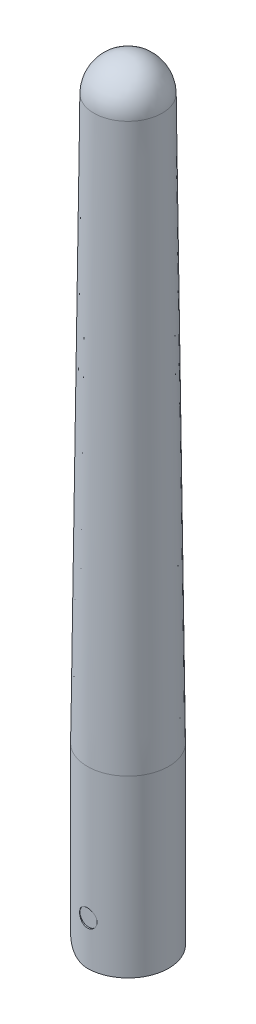
ISO-10303-21;
HEADER;
FILE_DESCRIPTION(('STEP AP214'),'2;1');
FILE_NAME('part.step','',(''),(''),'','','');
FILE_SCHEMA(('AUTOMOTIVE_DESIGN { 1 0 10303 214 1 1 1 1 }'));
ENDSEC;
DATA;
#1=APPLICATION_CONTEXT('core data for automotive mechanical design processes');
#2=APPLICATION_PROTOCOL_DEFINITION('international standard','automotive_design',2000,#1);
#3=PRODUCT_CONTEXT('',#1,'mechanical');
#4=PRODUCT('Part','Part','',(#3));
#5=PRODUCT_RELATED_PRODUCT_CATEGORY('part','',(#4));
#6=PRODUCT_DEFINITION_FORMATION('','',#4);
#7=PRODUCT_DEFINITION_CONTEXT('part definition',#1,'design');
#8=PRODUCT_DEFINITION('design','',#6,#7);
#9=PRODUCT_DEFINITION_SHAPE('','',#8);
#10=(LENGTH_UNIT() NAMED_UNIT(*) SI_UNIT(.MILLI.,.METRE.));
#11=(NAMED_UNIT(*) PLANE_ANGLE_UNIT() SI_UNIT($,.RADIAN.));
#12=(NAMED_UNIT(*) SI_UNIT($,.STERADIAN.) SOLID_ANGLE_UNIT());
#13=UNCERTAINTY_MEASURE_WITH_UNIT(LENGTH_MEASURE(1.E-05),#10,'distance_accuracy_value','');
#14=(GEOMETRIC_REPRESENTATION_CONTEXT(3) GLOBAL_UNCERTAINTY_ASSIGNED_CONTEXT((#13)) GLOBAL_UNIT_ASSIGNED_CONTEXT((#10,
#11,#12)) REPRESENTATION_CONTEXT('',''));
#15=CARTESIAN_POINT('',(0.,0.,0.));
#16=DIRECTION('',(0.,0.,1.));
#17=DIRECTION('',(1.,0.,0.));
#18=AXIS2_PLACEMENT_3D('',#15,#16,#17);
#19=CARTESIAN_POINT('',(0.,5.,-5.));
#20=DIRECTION('',(0.,0.,1.));
#21=DIRECTION('',(1.,0.,0.));
#22=AXIS2_PLACEMENT_3D('',#19,#20,#21);
#23=CYLINDRICAL_SURFACE('',#22,0.999999999999999);
#24=CARTESIAN_POINT('',(0.,6.,-4.65));
#25=CARTESIAN_POINT('',(-0.0554857924595718,5.99999807353634,-4.64999897405825));
#26=CARTESIAN_POINT('',(-0.110995075985709,5.9953663965125,-4.64899676720025));
#27=CARTESIAN_POINT('',(-0.220438479357284,5.97698037923054,-4.64509553965485));
#28=CARTESIAN_POINT('',(-0.274371418026741,5.963219372399,-4.64219513285273));
#29=CARTESIAN_POINT('',(-0.379064488271266,5.92702440035236,-4.63482063282781));
#30=CARTESIAN_POINT('',(-0.429827816687441,5.90459934329033,-4.6303481563912));
#31=CARTESIAN_POINT('',(-0.526869356090529,5.85174074893083,-4.6203129291471));
#32=CARTESIAN_POINT('',(-0.573147713364676,5.82130747295948,-4.61475021391805));
#33=CARTESIAN_POINT('',(-0.660626988615055,5.75279562723433,-4.60304781125343));
#34=CARTESIAN_POINT('',(-0.701748213889969,5.71461648115752,-4.59690116707922));
#35=CARTESIAN_POINT('',(-0.777055128833326,5.63191263980964,-4.58477300899257));
#36=CARTESIAN_POINT('',(-0.811240216336226,5.58738739416839,-4.57879150945618));
#37=CARTESIAN_POINT('',(-0.87205356348161,5.4926692674297,-4.56760243735744));
#38=CARTESIAN_POINT('',(-0.898597454097875,5.44242106965654,-4.56240378679981));
#39=CARTESIAN_POINT('',(-0.942833879374378,5.33804715155961,-4.55346866998021));
#40=CARTESIAN_POINT('',(-0.960527434603887,5.28392187914083,-4.54973203513792));
#41=CARTESIAN_POINT('',(-0.9862984982383,5.17419330395106,-4.54421478538731));
#42=CARTESIAN_POINT('',(-0.994516850008705,5.11862454935533,-4.54240555245428));
#43=CARTESIAN_POINT('',(-1.0015420598175,5.00686978789065,-4.54086196758284));
#44=CARTESIAN_POINT('',(-1.00035003485907,4.95068385507079,-4.54112736938713));
#45=CARTESIAN_POINT('',(-0.988701778425597,4.84033331199993,-4.54367713915638));
#46=CARTESIAN_POINT('',(-0.97840872062276,4.78615053181548,-4.54592594463625));
#47=CARTESIAN_POINT('',(-0.949108903825455,4.68029927607725,-4.55213295894203));
#48=CARTESIAN_POINT('',(-0.930101670596141,4.6286309375314,-4.55609126079991));
#49=CARTESIAN_POINT('',(-0.883762014712858,4.52881418854472,-4.56530657720991));
#50=CARTESIAN_POINT('',(-0.856366458973154,4.48069602883927,-4.57057338121047));
#51=CARTESIAN_POINT('',(-0.794072239245958,4.38967920884246,-4.58180620576488));
#52=CARTESIAN_POINT('',(-0.759172584810128,4.3467812387232,-4.58777231857151));
#53=CARTESIAN_POINT('',(-0.681995075463314,4.26648263635779,-4.59988441652921));
#54=CARTESIAN_POINT('',(-0.639578362206853,4.22921551171836,-4.60603155614488));
#55=CARTESIAN_POINT('',(-0.549028173989382,4.16230243923273,-4.61769949494304));
#56=CARTESIAN_POINT('',(-0.500894602074504,4.13265662066547,-4.62322028349995));
#57=CARTESIAN_POINT('',(-0.400117050997175,4.0817964011211,-4.63303046927939));
#58=CARTESIAN_POINT('',(-0.347464213637529,4.06059904080831,-4.63731737295029));
#59=CARTESIAN_POINT('',(-0.239231451253663,4.02738940140906,-4.64415816698036));
#60=CARTESIAN_POINT('',(-0.183651938565884,4.01537583210844,-4.64671230076757));
#61=CARTESIAN_POINT('',(-0.0722891337289174,4.00106793120755,-4.64976527600945));
#62=CARTESIAN_POINT('',(-0.0165303083545522,3.99859116023093,-4.65030269221159));
#63=CARTESIAN_POINT('',(0.0946043665298146,4.0029333103995,-4.64936958381492));
#64=CARTESIAN_POINT('',(0.149980240867893,4.00975162312352,-4.64789919063974));
#65=CARTESIAN_POINT('',(0.258175842986799,4.032339047909,-4.64313998101155));
#66=CARTESIAN_POINT('',(0.311016386718597,4.04801289095834,-4.63987052868503));
#67=CARTESIAN_POINT('',(0.41331859819371,4.08776104180973,-4.63187897346123));
#68=CARTESIAN_POINT('',(0.462779984357439,4.11183604864833,-4.62715674968691));
#69=CARTESIAN_POINT('',(0.557677299421223,4.1680861878844,-4.61668809086846));
#70=CARTESIAN_POINT('',(0.603047879895561,4.20036903769322,-4.61092835844335));
#71=CARTESIAN_POINT('',(0.687793228767505,4.27197614777281,-4.59905151307496));
#72=CARTESIAN_POINT('',(0.727167245039442,4.31130128998715,-4.59293435543415));
#73=CARTESIAN_POINT('',(0.799519617648643,4.39671257415101,-4.58089950791694));
#74=CARTESIAN_POINT('',(0.832371853862241,4.44290646601965,-4.57498729614063));
#75=CARTESIAN_POINT('',(0.889852384137302,4.54026332490397,-4.56415619087708));
#76=CARTESIAN_POINT('',(0.91448102973406,4.59142607939408,-4.55923725493366));
#77=CARTESIAN_POINT('',(0.954651827627161,4.6969964698085,-4.55099558196286));
#78=CARTESIAN_POINT('',(0.970244396983296,4.75138419767117,-4.54766400712229));
#79=CARTESIAN_POINT('',(0.992049287069363,4.86208831577926,-4.54295772671932));
#80=CARTESIAN_POINT('',(0.998263050557005,4.9184044080177,-4.54158272017654));
#81=CARTESIAN_POINT('',(1.00107413906364,5.03009614916858,-4.54096377454058));
#82=CARTESIAN_POINT('',(0.997871286631073,5.08546661768283,-4.54167555253668));
#83=CARTESIAN_POINT('',(0.982385622848902,5.19485921498462,-4.54505007229099));
#84=CARTESIAN_POINT('',(0.970102911205488,5.24888135857142,-4.54771279262585));
#85=CARTESIAN_POINT('',(0.936901264402288,5.35389148593029,-4.554667945109));
#86=CARTESIAN_POINT('',(0.916010485301002,5.40488874736638,-4.55895506039278));
#87=CARTESIAN_POINT('',(0.866210255179605,5.50268451819337,-4.56867821636762));
#88=CARTESIAN_POINT('',(0.837300001032319,5.54948260642768,-4.57411437211877));
#89=CARTESIAN_POINT('',(0.771614707032063,5.63853869336091,-4.58565602670299));
#90=CARTESIAN_POINT('',(0.734696868631129,5.6806899603462,-4.59177253969072));
#91=CARTESIAN_POINT('',(0.654334890778408,5.75826478928718,-4.60391072855208));
#92=CARTESIAN_POINT('',(0.610889247223803,5.79368679645147,-4.60993238221449));
#93=CARTESIAN_POINT('',(0.518053418011249,5.85721869742576,-4.62129119514587));
#94=CARTESIAN_POINT('',(0.468595959872542,5.88523206978638,-4.62661889958335));
#95=CARTESIAN_POINT('',(0.365571182862733,5.93250421075011,-4.63589507861853));
#96=CARTESIAN_POINT('',(0.312007409106338,5.95177043374239,-4.63984472693929));
#97=CARTESIAN_POINT('',(0.215313355688428,5.9775069113644,-4.64520226980472));
#98=CARTESIAN_POINT('',(0.172712040604148,5.98592594360409,-4.64699040095965));
#99=CARTESIAN_POINT('',(0.0867452486763794,5.99717312478714,-4.64938964264282));
#100=CARTESIAN_POINT('',(0.043379803674831,6.00000150614439,-4.65000080209996));
#101=CARTESIAN_POINT('',(0.,6.,-4.65));
#102=B_SPLINE_CURVE_WITH_KNOTS('',3,(#24,#25,#26,#27,#28,#29,#30,#31,#32,#33,#34,#35,#36,#37,
#38,#39,#40,#41,#42,#43,#44,#45,#46,#47,#48,#49,#50,#51,#52,#53,#54,#55,#56,#57,#58,#59,#60,#61,
#62,#63,#64,#65,#66,#67,#68,#69,#70,#71,#72,#73,#74,#75,#76,#77,#78,#79,#80,#81,#82,#83,#84,#85,
#86,#87,#88,#89,#90,#91,#92,#93,#94,#95,#96,#97,#98,#99,#100,#101),.UNSPECIFIED.,.T.,.F.,(4,2,2,
2,2,2,2,2,2,2,2,2,2,2,2,2,2,2,2,2,2,2,2,2,2,2,2,2,2,2,2,2,2,2,2,2,2,2,4),(0.,0.166298608654109,
0.332718788552363,0.498968312924373,0.665212412874777,0.833771872547252,1.00234595956904,
1.17271559361801,1.34306557709861,1.51084936472618,1.67861323686987,1.8434288924275,
2.00825351849615,2.17435049677215,2.34046941126949,2.5100573621822,2.6796481895971,
2.84957937379141,3.01948668027197,3.18612701856251,3.35275644972782,3.51762648962339,
3.68251025115094,3.84968095366846,4.01687260651793,4.18703602715356,4.35719217285162,
4.52638955223921,4.69556090105153,4.86116848302929,5.02677424649256,5.19184257791003,
5.35692744641425,5.52524196867348,5.69359533272957,5.86404459628471,6.03434832772318,
6.16436901578423,6.29438429852655),.UNSPECIFIED.);
#103=CARTESIAN_POINT('',(0.,6.,-4.65));
#104=VERTEX_POINT('',#103);
#105=EDGE_CURVE('E118',#104,#104,#102,.T.);
#106=ORIENTED_EDGE('',*,*,#105,.F.);
#107=EDGE_LOOP('',(#106));
#108=FACE_BOUND('',#107,.T.);
#109=CARTESIAN_POINT('',(0.,5.,-4.5));
#110=DIRECTION('',(0.,0.,1.));
#111=DIRECTION('',(1.,0.,0.));
#112=AXIS2_PLACEMENT_3D('',#109,#110,#111);
#113=CIRCLE('',#112,0.999999999999999);
#114=CARTESIAN_POINT('',(1.,5.,-4.5));
#115=VERTEX_POINT('',#114);
#116=EDGE_CURVE('E11',#115,#115,#113,.F.);
#117=ORIENTED_EDGE('',*,*,#116,.F.);
#118=EDGE_LOOP('',(#117));
#119=FACE_BOUND('',#118,.T.);
#120=ADVANCED_FACE('F36',(#108,#119),#23,.F.);
#121=CARTESIAN_POINT('',(0.,5.,-2.5));
#122=DIRECTION('',(0.,0.,1.));
#123=DIRECTION('',(1.,0.,0.));
#124=AXIS2_PLACEMENT_3D('',#121,#122,#123);
#125=PLANE('',#124);
#126=CARTESIAN_POINT('',(0.,5.,-2.5));
#127=DIRECTION('',(0.,0.,1.));
#128=DIRECTION('',(1.,0.,0.));
#129=AXIS2_PLACEMENT_3D('',#126,#127,#128);
#130=CIRCLE('',#129,0.999999999999999);
#131=CARTESIAN_POINT('',(1.,5.,-2.5));
#132=VERTEX_POINT('',#131);
#133=EDGE_CURVE('E244',#132,#132,#130,.F.);
#134=ORIENTED_EDGE('',*,*,#133,.T.);
#135=EDGE_LOOP('',(#134));
#136=FACE_BOUND('',#135,.T.);
#137=CARTESIAN_POINT('',(0.,5.,-2.5));
#138=DIRECTION('',(0.,0.,1.));
#139=DIRECTION('',(1.,0.,0.));
#140=AXIS2_PLACEMENT_3D('',#137,#138,#139);
#141=CIRCLE('',#140,5.);
#142=CARTESIAN_POINT('',(0.,0.,-2.5));
#143=VERTEX_POINT('',#142);
#144=CARTESIAN_POINT('',(-3.92077798402307,1.89717870317997,-2.5));
#145=VERTEX_POINT('',#144);
#146=EDGE_CURVE('E96',#143,#145,#141,.F.);
#147=ORIENTED_EDGE('',*,*,#146,.F.);
#148=DIRECTION('',(1.,0.,0.));
#149=VECTOR('',#148,1.);
#150=CARTESIAN_POINT('',(3.,0.,-2.5));
#151=LINE('',#150,#149);
#152=CARTESIAN_POINT('',(3.,0.,-2.5));
#153=VERTEX_POINT('',#152);
#154=EDGE_CURVE('E110',#143,#153,#151,.T.);
#155=ORIENTED_EDGE('',*,*,#154,.T.);
#156=DIRECTION('',(0.,1.,0.));
#157=VECTOR('',#156,1.);
#158=CARTESIAN_POINT('',(3.,0.,-2.5));
#159=LINE('',#158,#157);
#160=CARTESIAN_POINT('',(3.,5.,-2.5));
#161=VERTEX_POINT('',#160);
#162=EDGE_CURVE('E192',#153,#161,#159,.T.);
#163=ORIENTED_EDGE('',*,*,#162,.T.);
#164=CARTESIAN_POINT('',(0.,5.,-2.5));
#165=DIRECTION('',(0.,0.,1.));
#166=DIRECTION('',(1.,0.,0.));
#167=AXIS2_PLACEMENT_3D('',#164,#165,#166);
#168=CIRCLE('',#167,3.);
#169=CARTESIAN_POINT('',(0.,8.,-2.5));
#170=VERTEX_POINT('',#169);
#171=EDGE_CURVE('E197',#161,#170,#168,.T.);
#172=ORIENTED_EDGE('',*,*,#171,.T.);
#173=DIRECTION('',(-1.,0.,0.));
#174=VECTOR('',#173,1.);
#175=CARTESIAN_POINT('',(-4.65,8.,-2.5));
#176=LINE('',#175,#174);
#177=CARTESIAN_POINT('',(-3.92077798402307,8.,-2.5));
#178=VERTEX_POINT('',#177);
#179=EDGE_CURVE('E201',#170,#178,#176,.T.);
#180=ORIENTED_EDGE('',*,*,#179,.T.);
#181=DIRECTION('',(0.,-1.,0.));
#182=VECTOR('',#181,1.);
#183=CARTESIAN_POINT('',(-3.92077798402307,0.,-2.5));
#184=LINE('',#183,#182);
#185=EDGE_CURVE('E131',#178,#145,#184,.T.);
#186=ORIENTED_EDGE('',*,*,#185,.T.);
#187=EDGE_LOOP('',(#147,#155,#163,#172,#180,#186));
#188=FACE_BOUND('',#187,.T.);
#189=ADVANCED_FACE('F171',(#136,#188),#125,.T.);
#190=CARTESIAN_POINT('',(0.,5.,2.5));
#191=DIRECTION('',(0.,0.,1.));
#192=DIRECTION('',(1.,0.,0.));
#193=AXIS2_PLACEMENT_3D('',#190,#191,#192);
#194=PLANE('',#193);
#195=CARTESIAN_POINT('',(0.,5.,2.5));
#196=DIRECTION('',(0.,0.,1.));
#197=DIRECTION('',(1.,0.,0.));
#198=AXIS2_PLACEMENT_3D('',#195,#196,#197);
#199=CIRCLE('',#198,0.999999999999999);
#200=CARTESIAN_POINT('',(1.,5.,2.5));
#201=VERTEX_POINT('',#200);
#202=EDGE_CURVE('E222',#201,#201,#199,.F.);
#203=ORIENTED_EDGE('',*,*,#202,.F.);
#204=EDGE_LOOP('',(#203));
#205=FACE_BOUND('',#204,.T.);
#206=DIRECTION('',(1.,0.,0.));
#207=VECTOR('',#206,1.);
#208=CARTESIAN_POINT('',(3.,0.,2.5));
#209=LINE('',#208,#207);
#210=CARTESIAN_POINT('',(0.,0.,2.5));
#211=VERTEX_POINT('',#210);
#212=CARTESIAN_POINT('',(3.,0.,2.5));
#213=VERTEX_POINT('',#212);
#214=EDGE_CURVE('E102',#211,#213,#209,.T.);
#215=ORIENTED_EDGE('',*,*,#214,.F.);
#216=CARTESIAN_POINT('',(0.,5.,2.5));
#217=DIRECTION('',(0.,0.,1.));
#218=DIRECTION('',(1.,0.,0.));
#219=AXIS2_PLACEMENT_3D('',#216,#217,#218);
#220=CIRCLE('',#219,5.);
#221=CARTESIAN_POINT('',(-3.92077798402307,1.89717870317997,2.5));
#222=VERTEX_POINT('',#221);
#223=EDGE_CURVE('E45',#211,#222,#220,.F.);
#224=ORIENTED_EDGE('',*,*,#223,.T.);
#225=DIRECTION('',(0.,-1.,0.));
#226=VECTOR('',#225,1.);
#227=CARTESIAN_POINT('',(-3.92077798402307,0.,2.5));
#228=LINE('',#227,#226);
#229=CARTESIAN_POINT('',(-3.92077798402307,8.,2.5));
#230=VERTEX_POINT('',#229);
#231=EDGE_CURVE('E228',#230,#222,#228,.T.);
#232=ORIENTED_EDGE('',*,*,#231,.F.);
#233=DIRECTION('',(-1.,0.,0.));
#234=VECTOR('',#233,1.);
#235=CARTESIAN_POINT('',(-4.65,8.,2.5));
#236=LINE('',#235,#234);
#237=CARTESIAN_POINT('',(0.,8.,2.5));
#238=VERTEX_POINT('',#237);
#239=EDGE_CURVE('E193',#238,#230,#236,.T.);
#240=ORIENTED_EDGE('',*,*,#239,.F.);
#241=CARTESIAN_POINT('',(0.,5.,2.5));
#242=DIRECTION('',(0.,0.,1.));
#243=DIRECTION('',(1.,0.,0.));
#244=AXIS2_PLACEMENT_3D('',#241,#242,#243);
#245=CIRCLE('',#244,3.);
#246=CARTESIAN_POINT('',(3.,5.,2.5));
#247=VERTEX_POINT('',#246);
#248=EDGE_CURVE('E212',#247,#238,#245,.T.);
#249=ORIENTED_EDGE('',*,*,#248,.F.);
#250=DIRECTION('',(0.,1.,0.));
#251=VECTOR('',#250,1.);
#252=CARTESIAN_POINT('',(3.,0.,2.5));
#253=LINE('',#252,#251);
#254=EDGE_CURVE('E208',#213,#247,#253,.T.);
#255=ORIENTED_EDGE('',*,*,#254,.F.);
#256=EDGE_LOOP('',(#215,#224,#232,#240,#249,#255));
#257=FACE_BOUND('',#256,.T.);
#258=ADVANCED_FACE('F168',(#205,#257),#194,.F.);
#259=CARTESIAN_POINT('',(-4.65,0.,0.));
#260=DIRECTION('',(0.,1.,0.));
#261=DIRECTION('',(0.,0.,1.));
#262=AXIS2_PLACEMENT_3D('',#259,#260,#261);
#263=PLANE('',#262);
#264=CARTESIAN_POINT('',(0.,0.,0.));
#265=DIRECTION('',(0.,-1.,0.));
#266=DIRECTION('',(0.,0.,-1.));
#267=AXIS2_PLACEMENT_3D('',#264,#265,#266);
#268=CIRCLE('',#267,4.65);
#269=CARTESIAN_POINT('',(0.,0.,-4.65));
#270=VERTEX_POINT('',#269);
#271=CARTESIAN_POINT('',(0.,0.,4.65));
#272=VERTEX_POINT('',#271);
#273=EDGE_CURVE('E108',#270,#272,#268,.T.);
#274=ORIENTED_EDGE('',*,*,#273,.T.);
#275=DIRECTION('',(0.,0.,1.));
#276=VECTOR('',#275,1.);
#277=CARTESIAN_POINT('',(0.,0.,-5.));
#278=LINE('',#277,#276);
#279=EDGE_CURVE('E112',#211,#272,#278,.T.);
#280=ORIENTED_EDGE('',*,*,#279,.F.);
#281=ORIENTED_EDGE('',*,*,#214,.T.);
#282=DIRECTION('',(0.,0.,1.));
#283=VECTOR('',#282,1.);
#284=CARTESIAN_POINT('',(3.,0.,-2.5));
#285=LINE('',#284,#283);
#286=EDGE_CURVE('E205',#153,#213,#285,.T.);
#287=ORIENTED_EDGE('',*,*,#286,.F.);
#288=ORIENTED_EDGE('',*,*,#154,.F.);
#289=EDGE_CURVE('E52',#270,#143,#278,.T.);
#290=ORIENTED_EDGE('',*,*,#289,.F.);
#291=EDGE_LOOP('',(#274,#280,#281,#287,#288,#290));
#292=FACE_BOUND('',#291,.T.);
#293=ADVANCED_FACE('F38',(#292),#263,.F.);
#294=CARTESIAN_POINT('',(0.,0.,0.));
#295=DIRECTION('',(0.,-1.,0.));
#296=DIRECTION('',(0.,0.,-1.));
#297=AXIS2_PLACEMENT_3D('',#294,#295,#296);
#298=CYLINDRICAL_SURFACE('',#297,4.65);
#299=CARTESIAN_POINT('',(0.,20.,0.));
#300=DIRECTION('',(0.,-1.,0.));
#301=DIRECTION('',(0.,0.,-1.));
#302=AXIS2_PLACEMENT_3D('',#299,#300,#301);
#303=CIRCLE('',#302,4.65000000000001);
#304=CARTESIAN_POINT('',(0.,20.,-4.65000000000001));
#305=VERTEX_POINT('',#304);
#306=EDGE_CURVE('E117',#305,#305,#303,.T.);
#307=ORIENTED_EDGE('',*,*,#306,.T.);
#308=EDGE_LOOP('',(#307));
#309=FACE_BOUND('',#308,.T.);
#310=CARTESIAN_POINT('',(1.,5.,4.54120028186382));
#311=CARTESIAN_POINT('',(0.999998061377611,4.94453093291564,4.5412014023174));
#312=CARTESIAN_POINT('',(0.995369081466296,4.8890383441639,4.54222764899231));
#313=CARTESIAN_POINT('',(0.976994747180012,4.77962959734415,4.5462145141857));
#314=CARTESIAN_POINT('',(0.963242659642441,4.72571463432557,4.54917656136652));
#315=CARTESIAN_POINT('',(0.927073760173568,4.6210596486986,4.55668439948254));
#316=CARTESIAN_POINT('',(0.904666274524266,4.57031627680862,4.5612284852363));
#317=CARTESIAN_POINT('',(0.851849110144027,4.47330842898144,4.5713863486454));
#318=CARTESIAN_POINT('',(0.821439652926239,4.42704382910993,4.57700009668882));
#319=CARTESIAN_POINT('',(0.752952312186891,4.33955007895194,4.58876719801051));
#320=CARTESIAN_POINT('',(0.714768498719361,4.29840473499855,4.59492725798048));
#321=CARTESIAN_POINT('',(0.632045060531734,4.22305096851829,4.60703412192779));
#322=CARTESIAN_POINT('',(0.587504952344224,4.18884307414179,4.61298090964029));
#323=CARTESIAN_POINT('',(0.492772756420345,4.12800500720834,4.62406408488806));
#324=CARTESIAN_POINT('',(0.442527904845659,4.10145524636674,4.62919163717388));
#325=CARTESIAN_POINT('',(0.338161209320949,4.05720705858034,4.63798293270179));
#326=CARTESIAN_POINT('',(0.284039786424052,4.03950767201529,4.64164683463456));
#327=CARTESIAN_POINT('',(0.174327330045017,4.01372569362776,4.64705061582205));
#328=CARTESIAN_POINT('',(0.118771032454976,4.00550132611807,4.64881883175429));
#329=CARTESIAN_POINT('',(0.00704098292571893,3.99845976220167,4.65033012592679));
#330=CARTESIAN_POINT('',(-0.049132699945031,3.99964152399238,4.65007342844211));
#331=CARTESIAN_POINT('',(-0.159526233634743,4.01127268760517,4.6475855360152));
#332=CARTESIAN_POINT('',(-0.213763024511669,4.02156929406663,4.64538689589724));
#333=CARTESIAN_POINT('',(-0.319720430231769,4.05089460936944,4.63929917332629));
#334=CARTESIAN_POINT('',(-0.371440933716928,4.069923704278,4.63541001613519));
#335=CARTESIAN_POINT('',(-0.471324143224281,4.11631027374313,4.62632563052872));
#336=CARTESIAN_POINT('',(-0.519458908009805,4.1437260587627,4.62112130360422));
#337=CARTESIAN_POINT('',(-0.610500537617863,4.20606436319485,4.60997785374269));
#338=CARTESIAN_POINT('',(-0.65340671129042,4.24098787334565,4.60403863387128));
#339=CARTESIAN_POINT('',(-0.733681574611819,4.3181834409456,4.59193803297618));
#340=CARTESIAN_POINT('',(-0.770921462026489,4.36058922918665,4.58577458639596));
#341=CARTESIAN_POINT('',(-0.837784631224758,4.45110748228109,4.57403243707326));
#342=CARTESIAN_POINT('',(-0.867407720204438,4.49922009154612,4.56845374913489));
#343=CARTESIAN_POINT('',(-0.918251014871746,4.59998975366086,4.55850756915199));
#344=CARTESIAN_POINT('',(-0.939447589638443,4.6526590891783,4.5541434934311));
#345=CARTESIAN_POINT('',(-0.972650713684467,4.76092801978455,4.54716850460818));
#346=CARTESIAN_POINT('',(-0.984658667254468,4.81652716572364,4.54455732361995));
#347=CARTESIAN_POINT('',(-0.998945383482811,4.92790247236098,4.54143821724257));
#348=CARTESIAN_POINT('',(-1.00141137861828,4.98365351014681,4.54088982190733));
#349=CARTESIAN_POINT('',(-0.997050463630703,5.09477011591634,4.54184931759482));
#350=CARTESIAN_POINT('',(-0.990224169014363,5.15013570918711,4.54335707242139));
#351=CARTESIAN_POINT('',(-0.967634690403716,5.25826246425319,4.5482208301264));
#352=CARTESIAN_POINT('',(-0.95197400379383,5.31104608130759,4.55155562299521));
#353=CARTESIAN_POINT('',(-0.912270988572368,5.41324019398218,4.55967868481341));
#354=CARTESIAN_POINT('',(-0.888227879835751,5.46265037513554,4.56446708904035));
#355=CARTESIAN_POINT('',(-0.832027723362451,5.55750712684327,4.57504716218382));
#356=CARTESIAN_POINT('',(-0.799754968464526,5.60288356178927,4.58085273380345));
#357=CARTESIAN_POINT('',(-0.728163597015683,5.68764534429005,4.5927760388017));
#358=CARTESIAN_POINT('',(-0.688844136038908,5.72702997278353,4.59889380952907));
#359=CARTESIAN_POINT('',(-0.603429585063121,5.79941347555159,4.61088518288888));
#360=CARTESIAN_POINT('',(-0.557225456006455,5.83228491159056,4.61675242416132));
#361=CARTESIAN_POINT('',(-0.459842205599925,5.88979910835873,4.62746595128161));
#362=CARTESIAN_POINT('',(-0.408663312454066,5.91444224630932,4.63231228392864));
#363=CARTESIAN_POINT('',(-0.303096573483936,5.95462115497887,4.64041104901312));
#364=CARTESIAN_POINT('',(-0.248731049651972,5.97021349357341,4.64367336021419));
#365=CARTESIAN_POINT('',(-0.138074421576381,5.99202541331524,4.64827915411215));
#366=CARTESIAN_POINT('',(-0.0817835885798744,5.99824630924063,4.64962290597431));
#367=CARTESIAN_POINT('',(0.0299144916959156,6.00108129288986,4.65023251424144));
#368=CARTESIAN_POINT('',(0.0853167645027369,5.99788591317011,4.64953958242792));
#369=CARTESIAN_POINT('',(0.194774984388046,5.98240411917546,4.64624164414481));
#370=CARTESIAN_POINT('',(0.248830954101325,5.97011785784826,4.643636669844));
#371=CARTESIAN_POINT('',(0.353920528735113,5.93689306870708,4.6368100144181));
#372=CARTESIAN_POINT('',(0.404962753108561,5.91598073399643,4.6325932303777));
#373=CARTESIAN_POINT('',(0.502839677045204,5.86612328876748,4.62299398757843));
#374=CARTESIAN_POINT('',(0.549673982472589,5.83717742682293,4.61761141978685));
#375=CARTESIAN_POINT('',(0.638737627229704,5.77144896384927,4.60614478979625));
#376=CARTESIAN_POINT('',(0.680866311260507,5.73453189430102,4.60004963703792));
#377=CARTESIAN_POINT('',(0.758395938936273,5.65418124214266,4.58790574906477));
#378=CARTESIAN_POINT('',(0.793795265207963,5.61074609741753,4.58185702534334));
#379=CARTESIAN_POINT('',(0.857297698380311,5.51792238674221,4.57040456790059));
#380=CARTESIAN_POINT('',(0.885301375517002,5.46846459279452,4.56501010431646));
#381=CARTESIAN_POINT('',(0.932555302408443,5.36544014173055,4.55559278760816));
#382=CARTESIAN_POINT('',(0.951813069584282,5.31187705972251,4.55156875729483));
#383=CARTESIAN_POINT('',(0.977529823374791,5.21520441099507,4.54610404039405));
#384=CARTESIAN_POINT('',(0.985940203963754,5.17262502075549,4.5442771689979));
#385=CARTESIAN_POINT('',(0.997175922716001,5.08670185428717,4.54182487919502));
#386=CARTESIAN_POINT('',(1.00000151534924,5.04335811297676,4.5411994060468));
#387=CARTESIAN_POINT('',(1.,5.,4.54120028186382));
#388=B_SPLINE_CURVE_WITH_KNOTS('',3,(#310,#311,#312,#313,#314,#315,#316,#317,#318,#319,#320,
#321,#322,#323,#324,#325,#326,#327,#328,#329,#330,#331,#332,#333,#334,#335,#336,#337,#338,#339,
#340,#341,#342,#343,#344,#345,#346,#347,#348,#349,#350,#351,#352,#353,#354,#355,#356,#357,#358,
#359,#360,#361,#362,#363,#364,#365,#366,#367,#368,#369,#370,#371,#372,#373,#374,#375,#376,#377,
#378,#379,#380,#381,#382,#383,#384,#385,#386,#387),.UNSPECIFIED.,.T.,.F.,(4,2,2,2,2,2,2,2,2,2,2,
2,2,2,2,2,2,2,2,2,2,2,2,2,2,2,2,2,2,2,2,2,2,2,2,2,2,2,4),(0.,0.1662483282688,0.33261949014215,
0.49881188317551,0.664999676101485,0.833624917105705,1.00226299079106,1.17261220386305,
1.34294294245974,1.51069047563743,1.67841942971914,1.84338882988654,2.00836552412765,
2.17451638290778,2.34068918084511,2.5102058105435,2.67972673079176,2.84971974954232,
3.01968678318484,3.18630128708414,3.35290475523695,3.51761389669694,3.68233837120018,
3.84952052019207,4.01672271648518,4.18692885279664,4.3571271850379,4.52624998725626,
4.6953490599724,4.86105016273487,5.02674847775583,5.19194731043145,5.35716160040228,
5.52541760058755,5.69371398941815,5.86416946143762,6.03447814231936,6.16443421769268,
6.29438437150206),.UNSPECIFIED.);
#389=CARTESIAN_POINT('',(1.,5.,4.54120028186382));
#390=VERTEX_POINT('',#389);
#391=EDGE_CURVE('E128',#390,#390,#388,.T.);
#392=ORIENTED_EDGE('',*,*,#391,.T.);
#393=EDGE_LOOP('',(#392));
#394=FACE_BOUND('',#393,.T.);
#395=ORIENTED_EDGE('',*,*,#105,.T.);
#396=EDGE_LOOP('',(#395));
#397=FACE_BOUND('',#396,.T.);
#398=ORIENTED_EDGE('',*,*,#273,.F.);
#399=CARTESIAN_POINT('',(0.,0.,-4.65));
#400=CARTESIAN_POINT('',(-0.10713801750042,-2.71763937118196E-05,-4.65002670368583));
#401=CARTESIAN_POINT('',(-0.214258462087376,0.00344235775294874,-4.64629846345955));
#402=CARTESIAN_POINT('',(-0.427477903478373,0.0171701582749897,-4.63153396366365));
#403=CARTESIAN_POINT('',(-0.533577610801972,0.0274232941148468,-4.62050322707323));
#404=CARTESIAN_POINT('',(-0.743061616065105,0.0544018386514194,-4.59145599603495));
#405=CARTESIAN_POINT('',(-0.846461136257317,0.0710728659185516,-4.57349819496294));
#406=CARTESIAN_POINT('',(-1.05069734077919,0.110536751083018,-4.53093971811014));
#407=CARTESIAN_POINT('',(-1.15153367108257,0.133330449664895,-4.5063381300896));
#408=CARTESIAN_POINT('',(-1.34968807537047,0.184526715967329,-4.45099907842688));
#409=CARTESIAN_POINT('',(-1.44701593523186,0.212911978011044,-4.42028054339374));
#410=CARTESIAN_POINT('',(-1.63800273845569,0.274850651626358,-4.35312585264625));
#411=CARTESIAN_POINT('',(-1.73166029956561,0.308405987251248,-4.31668756822039));
#412=CARTESIAN_POINT('',(-2.0068117876758,0.416167884560868,-4.19940132163988));
#413=CARTESIAN_POINT('',(-2.18224160683275,0.497405675265086,-4.11065153538178));
#414=CARTESIAN_POINT('',(-2.58226986208224,0.710255336683099,-3.87655869578158));
#415=CARTESIAN_POINT('',(-2.79816951167609,0.848970548837515,-3.722825944871));
#416=CARTESIAN_POINT('',(-3.09481371061897,1.07094339267804,-3.47295688761621));
#417=CARTESIAN_POINT('',(-3.18927125963253,1.1473649662921,-3.38632395282137));
#418=CARTESIAN_POINT('',(-3.36931357039075,1.30379637902953,-3.20723085712229));
#419=CARTESIAN_POINT('',(-3.45489940030771,1.38380578450525,-3.11477139990319));
#420=CARTESIAN_POINT('',(-3.61936852192985,1.54832735503365,-2.92217681198976));
#421=CARTESIAN_POINT('',(-3.69803092223934,1.63290207571416,-2.82190762201182));
#422=CARTESIAN_POINT('',(-3.84640120196718,1.80344467861552,-2.61606478756361));
#423=CARTESIAN_POINT('',(-3.91610860380742,1.88941263486377,-2.51049086060431));
#424=CARTESIAN_POINT('',(-4.04663706612628,2.06123356258029,-2.29416119764752));
#425=CARTESIAN_POINT('',(-4.10746907424442,2.14708654404083,-2.18341207176582));
#426=CARTESIAN_POINT('',(-4.22038483469765,2.31695380260274,-1.95625570123244));
#427=CARTESIAN_POINT('',(-4.27247244592191,2.40096887645884,-1.83985098178327));
#428=CARTESIAN_POINT('',(-4.37028506862646,2.56884575168669,-1.59421228286424));
#429=CARTESIAN_POINT('',(-4.41553729119289,2.65247158394667,-1.46462587441147));
#430=CARTESIAN_POINT('',(-4.49566183604506,2.80984947660846,-1.19630067625471));
#431=CARTESIAN_POINT('',(-4.53053779569851,2.88360499201996,-1.05756511464246));
#432=CARTESIAN_POINT('',(-4.58048060255558,2.99454107517872,-0.808171936623379));
#433=CARTESIAN_POINT('',(-4.59835525736014,3.03621333448933,-0.700140878660446));
#434=CARTESIAN_POINT('',(-4.62665746815496,3.10384623968938,-0.47847723583765));
#435=CARTESIAN_POINT('',(-4.63711163107122,3.12986296843904,-0.364866241860459));
#436=CARTESIAN_POINT('',(-4.64957893431261,3.16104278844811,-0.132505509757859));
#437=CARTESIAN_POINT('',(-4.65147232712637,3.16591000531305,-0.0137062039669443));
#438=CARTESIAN_POINT('',(-4.64618519678675,3.1525733934543,0.222427838470223));
#439=CARTESIAN_POINT('',(-4.63899192442112,3.13433714889056,0.339760283552977));
#440=CARTESIAN_POINT('',(-4.61416668264602,3.07368874650333,0.592796026544656));
#441=CARTESIAN_POINT('',(-4.59467137345301,3.02702961876667,0.727230669949293));
#442=CARTESIAN_POINT('',(-4.54589378399897,2.91710197642653,0.987432449710274));
#443=CARTESIAN_POINT('',(-4.51656776798404,2.85375951424433,1.11315776833923));
#444=CARTESIAN_POINT('',(-4.44776342747485,2.71444832610034,1.36288794669896));
#445=CARTESIAN_POINT('',(-4.40785810612733,2.63801304652813,1.48650674258156));
#446=CARTESIAN_POINT('',(-4.31929620481515,2.47969469592378,1.72702365738549));
#447=CARTESIAN_POINT('',(-4.27063085990619,2.39780622081395,1.84391488894222));
#448=CARTESIAN_POINT('',(-4.1647262619393,2.23146289204889,2.07204606819295));
#449=CARTESIAN_POINT('',(-4.10747741759672,2.14700525282321,2.18327950520022));
#450=CARTESIAN_POINT('',(-3.98443804709195,1.97754547533849,2.40048577345308));
#451=CARTESIAN_POINT('',(-3.91864665595171,1.89254328277027,2.50645807047631));
#452=CARTESIAN_POINT('',(-3.76982245184316,1.7131139123917,2.72590972975973));
#453=CARTESIAN_POINT('',(-3.6856654520241,1.61880179709126,2.83872808708456));
#454=CARTESIAN_POINT('',(-3.50620887412806,1.43303702830748,3.05762194410242));
#455=CARTESIAN_POINT('',(-3.41090622784913,1.34158517102605,3.16369557462585));
#456=CARTESIAN_POINT('',(-3.10821596493741,1.07429710976275,3.47041661724327));
#457=CARTESIAN_POINT('',(-2.88349522196019,0.90483591732651,3.66039076547404));
#458=CARTESIAN_POINT('',(-2.46393695885446,0.644548691324877,3.9490448256634));
#459=CARTESIAN_POINT('',(-2.2810785759817,0.545547007667791,4.05785338199908));
#460=CARTESIAN_POINT('',(-1.89418712008197,0.367805832593486,4.25221018913663));
#461=CARTESIAN_POINT('',(-1.69017254869142,0.289048842920107,4.3377785309816));
#462=CARTESIAN_POINT('',(-1.29466520908975,0.166750155332819,4.47027406592431));
#463=CARTESIAN_POINT('',(-1.10552230354405,0.119791935719447,4.52096737357733));
#464=CARTESIAN_POINT('',(-0.815448739348464,0.0659599022594963,4.57900654621778));
#465=CARTESIAN_POINT('',(-0.717749803401241,0.0507869990833291,4.59534900245232));
#466=CARTESIAN_POINT('',(-0.520812655751447,0.0262112846137983,4.62180690708682));
#467=CARTESIAN_POINT('',(-0.421575325385597,0.0168052862613859,4.63192579492908));
#468=CARTESIAN_POINT('',(-0.268421778151792,0.0069214919479413,4.64255690077226));
#469=CARTESIAN_POINT('',(-0.214781793772686,0.00432635683071509,4.64534776157488));
#470=CARTESIAN_POINT('',(-0.107430468016869,0.000866028202529734,4.64906880217816));
#471=CARTESIAN_POINT('',(-0.0537192355290355,-7.32651989079754E-07,4.65000066777385));
#472=CARTESIAN_POINT('',(0.,0.,4.65));
#473=B_SPLINE_CURVE_WITH_KNOTS('',3,(#399,#400,#401,#402,#403,#404,#405,#406,#407,#408,#409,
#410,#411,#412,#413,#414,#415,#416,#417,#418,#419,#420,#421,#422,#423,#424,#425,#426,#427,#428,
#429,#430,#431,#432,#433,#434,#435,#436,#437,#438,#439,#440,#441,#442,#443,#444,#445,#446,#447,
#448,#449,#450,#451,#452,#453,#454,#455,#456,#457,#458,#459,#460,#461,#462,#463,#464,#465,#466,
#467,#468,#469,#470,#471,#472),.UNSPECIFIED.,.F.,.F.,(4,2,2,2,2,2,2,2,2,2,2,2,2,2,2,2,2,2,2,2,2,
2,2,2,2,2,2,2,2,2,2,2,2,2,2,2,4),(0.,0.321265355929062,0.642288011581748,0.960648343070879,
1.27905240997012,1.5964860874494,1.9140381851275,2.5499160219185,3.44220670375083,
3.88957612081142,4.33689161100386,4.79538334003107,5.25389951069233,5.71184523958068,
6.16958834342889,6.65117638167015,7.13259540122634,7.48307304144507,7.83228757210267,
8.18637207947174,8.54095394386177,8.9694460700709,9.39987038595901,9.85138227055817,
10.303348457541,10.7558234925423,11.208344378814,11.7160623367392,12.2239203910121,
13.2360431312209,13.937691680105,14.6387317127131,15.2400050511524,15.54033152764,
15.840491879829,16.0017650452065,16.1628918964301),.UNSPECIFIED.);
#474=EDGE_CURVE('E94',#270,#145,#473,.T.);
#475=ORIENTED_EDGE('',*,*,#474,.T.);
#476=ORIENTED_EDGE('',*,*,#185,.F.);
#477=CARTESIAN_POINT('',(0.,8.,0.));
#478=DIRECTION('',(0.,1.,0.));
#479=DIRECTION('',(0.,0.,1.));
#480=AXIS2_PLACEMENT_3D('',#477,#478,#479);
#481=CIRCLE('',#480,4.65);
#482=EDGE_CURVE('E136',#178,#230,#481,.T.);
#483=ORIENTED_EDGE('',*,*,#482,.T.);
#484=ORIENTED_EDGE('',*,*,#231,.T.);
#485=EDGE_CURVE('E60',#222,#272,#473,.T.);
#486=ORIENTED_EDGE('',*,*,#485,.T.);
#487=EDGE_LOOP('',(#398,#475,#476,#483,#484,#486));
#488=FACE_BOUND('',#487,.T.);
#489=ADVANCED_FACE('F114',(#309,#394,#397,#488),#298,.T.);
#490=CARTESIAN_POINT('',(0.,84.3,0.));
#491=DIRECTION('',(0.,-1.,0.));
#492=DIRECTION('',(-1.,0.,0.));
#493=AXIS2_PLACEMENT_3D('',#490,#491,#492);
#494=SPHERICAL_SURFACE('',#493,3.9);
#495=CARTESIAN_POINT('',(0.,84.3454707209718,0.));
#496=DIRECTION('',(0.,-1.,0.));
#497=DIRECTION('',(0.,0.,-1.));
#498=AXIS2_PLACEMENT_3D('',#495,#496,#497);
#499=CIRCLE('',#498,3.89973491580316);
#500=CARTESIAN_POINT('',(0.,84.3454707209718,-3.89973491580316));
#501=VERTEX_POINT('',#500);
#502=EDGE_CURVE('E124',#501,#501,#499,.T.);
#503=ORIENTED_EDGE('',*,*,#502,.F.);
#504=EDGE_LOOP('',(#503));
#505=FACE_BOUND('',#504,.T.);
#506=ADVANCED_FACE('F258',(#505),#494,.T.);
#507=CARTESIAN_POINT('',(0.,84.3454707209718,0.));
#508=DIRECTION('',(0.,-1.,0.));
#509=DIRECTION('',(0.,0.,-1.));
#510=AXIS2_PLACEMENT_3D('',#507,#508,#509);
#511=CONICAL_SURFACE('',#510,3.89973491580316,0.0116594233895895);
#512=ORIENTED_EDGE('',*,*,#306,.F.);
#513=EDGE_LOOP('',(#512));
#514=FACE_BOUND('',#513,.T.);
#515=ORIENTED_EDGE('',*,*,#502,.T.);
#516=EDGE_LOOP('',(#515));
#517=FACE_BOUND('',#516,.T.);
#518=ADVANCED_FACE('F153',(#514,#517),#511,.T.);
#519=CARTESIAN_POINT('',(0.,5.,4.5));
#520=DIRECTION('',(0.,0.,1.));
#521=DIRECTION('',(1.,0.,0.));
#522=AXIS2_PLACEMENT_3D('',#519,#520,#521);
#523=CIRCLE('',#522,0.999999999999999);
#524=CARTESIAN_POINT('',(1.,5.,4.5));
#525=VERTEX_POINT('',#524);
#526=EDGE_CURVE('E246',#525,#525,#523,.T.);
#527=ORIENTED_EDGE('',*,*,#526,.F.);
#528=EDGE_LOOP('',(#527));
#529=FACE_BOUND('',#528,.T.);
#530=ORIENTED_EDGE('',*,*,#391,.F.);
#531=EDGE_LOOP('',(#530));
#532=FACE_BOUND('',#531,.T.);
#533=ADVANCED_FACE('F148',(#529,#532),#23,.F.);
#534=CARTESIAN_POINT('',(-4.65,8.,-2.5));
#535=DIRECTION('',(0.,1.,0.));
#536=DIRECTION('',(0.,0.,1.));
#537=AXIS2_PLACEMENT_3D('',#534,#535,#536);
#538=PLANE('',#537);
#539=ORIENTED_EDGE('',*,*,#179,.F.);
#540=DIRECTION('',(0.,0.,1.));
#541=VECTOR('',#540,1.);
#542=CARTESIAN_POINT('',(0.,8.,-2.5));
#543=LINE('',#542,#541);
#544=EDGE_CURVE('E219',#170,#238,#543,.T.);
#545=ORIENTED_EDGE('',*,*,#544,.T.);
#546=ORIENTED_EDGE('',*,*,#239,.T.);
#547=ORIENTED_EDGE('',*,*,#482,.F.);
#548=EDGE_LOOP('',(#539,#545,#546,#547));
#549=FACE_BOUND('',#548,.T.);
#550=ADVANCED_FACE('F152',(#549),#538,.F.);
#551=CARTESIAN_POINT('',(0.,5.,-2.5));
#552=DIRECTION('',(0.,0.,1.));
#553=DIRECTION('',(1.,0.,0.));
#554=AXIS2_PLACEMENT_3D('',#551,#552,#553);
#555=CYLINDRICAL_SURFACE('',#554,3.);
#556=ORIENTED_EDGE('',*,*,#248,.T.);
#557=ORIENTED_EDGE('',*,*,#544,.F.);
#558=ORIENTED_EDGE('',*,*,#171,.F.);
#559=DIRECTION('',(0.,0.,1.));
#560=VECTOR('',#559,1.);
#561=CARTESIAN_POINT('',(3.,5.,-2.5));
#562=LINE('',#561,#560);
#563=EDGE_CURVE('E223',#161,#247,#562,.T.);
#564=ORIENTED_EDGE('',*,*,#563,.T.);
#565=EDGE_LOOP('',(#556,#557,#558,#564));
#566=FACE_BOUND('',#565,.T.);
#567=ADVANCED_FACE('F160',(#566),#555,.F.);
#568=CARTESIAN_POINT('',(3.,0.,-2.5));
#569=DIRECTION('',(1.,0.,0.));
#570=DIRECTION('',(0.,0.,-1.));
#571=AXIS2_PLACEMENT_3D('',#568,#569,#570);
#572=PLANE('',#571);
#573=ORIENTED_EDGE('',*,*,#254,.T.);
#574=ORIENTED_EDGE('',*,*,#563,.F.);
#575=ORIENTED_EDGE('',*,*,#162,.F.);
#576=ORIENTED_EDGE('',*,*,#286,.T.);
#577=EDGE_LOOP('',(#573,#574,#575,#576));
#578=FACE_BOUND('',#577,.T.);
#579=ADVANCED_FACE('F155',(#578),#572,.F.);
#580=CARTESIAN_POINT('',(0.,5.,-5.));
#581=DIRECTION('',(0.,0.,1.));
#582=DIRECTION('',(1.,0.,0.));
#583=AXIS2_PLACEMENT_3D('',#580,#581,#582);
#584=CYLINDRICAL_SURFACE('',#583,5.);
#585=ORIENTED_EDGE('',*,*,#223,.F.);
#586=ORIENTED_EDGE('',*,*,#279,.T.);
#587=ORIENTED_EDGE('',*,*,#485,.F.);
#588=EDGE_LOOP('',(#585,#586,#587));
#589=FACE_BOUND('',#588,.T.);
#590=ADVANCED_FACE('F159',(#589),#584,.T.);
#591=ORIENTED_EDGE('',*,*,#289,.T.);
#592=ORIENTED_EDGE('',*,*,#146,.T.);
#593=ORIENTED_EDGE('',*,*,#474,.F.);
#594=EDGE_LOOP('',(#591,#592,#593));
#595=FACE_BOUND('',#594,.T.);
#596=ADVANCED_FACE('F95',(#595),#584,.T.);
#597=CARTESIAN_POINT('',(0.,5.,4.5));
#598=DIRECTION('',(0.,0.,1.));
#599=DIRECTION('',(1.,0.,0.));
#600=AXIS2_PLACEMENT_3D('',#597,#598,#599);
#601=PLANE('',#600);
#602=ORIENTED_EDGE('',*,*,#526,.T.);
#603=EDGE_LOOP('',(#602));
#604=FACE_BOUND('',#603,.T.);
#605=ADVANCED_FACE('F179',(#604),#601,.T.);
#606=CARTESIAN_POINT('',(0.,5.,-4.5));
#607=DIRECTION('',(0.,0.,1.));
#608=DIRECTION('',(1.,0.,0.));
#609=AXIS2_PLACEMENT_3D('',#606,#607,#608);
#610=PLANE('',#609);
#611=ORIENTED_EDGE('',*,*,#116,.T.);
#612=EDGE_LOOP('',(#611));
#613=FACE_BOUND('',#612,.T.);
#614=ADVANCED_FACE('F266',(#613),#610,.F.);
#615=CARTESIAN_POINT('',(0.,5.,4.5));
#616=DIRECTION('',(0.,0.,-1.));
#617=DIRECTION('',(-1.,0.,0.));
#618=AXIS2_PLACEMENT_3D('',#615,#616,#617);
#619=CYLINDRICAL_SURFACE('',#618,0.999999999999999);
#620=ORIENTED_EDGE('',*,*,#133,.F.);
#621=EDGE_LOOP('',(#620));
#622=FACE_BOUND('',#621,.T.);
#623=ORIENTED_EDGE('',*,*,#202,.T.);
#624=EDGE_LOOP('',(#623));
#625=FACE_BOUND('',#624,.T.);
#626=ADVANCED_FACE('F180',(#622,#625),#619,.T.);
#627=CLOSED_SHELL('',(#120,#189,#258,#293,#489,#506,#518,#533,#550,#567,#579,#590,#596,#605,
#614,#626));
#628=MANIFOLD_SOLID_BREP('B2',#627);
#629=ADVANCED_BREP_SHAPE_REPRESENTATION('',(#18,#628),#14);
#630=SHAPE_DEFINITION_REPRESENTATION(#9,#629);
ENDSEC;
END-ISO-10303-21;
